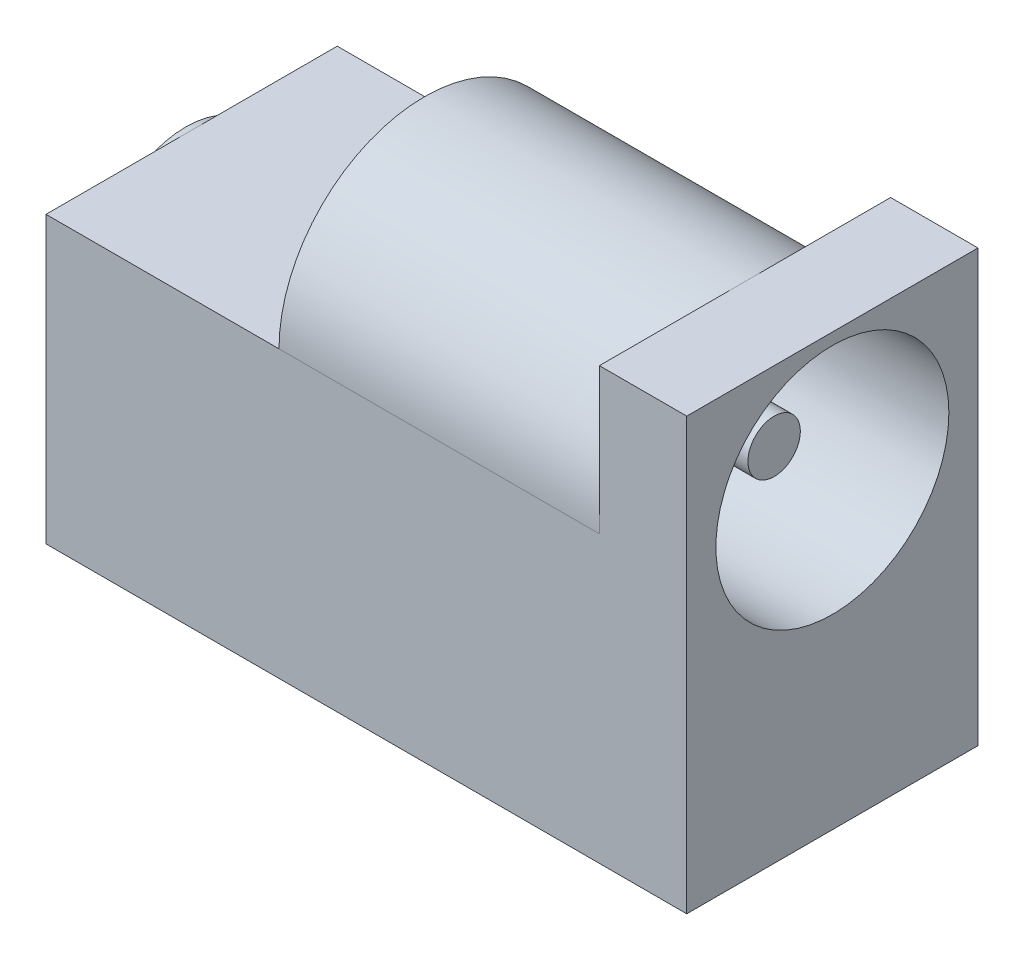
ISO-10303-21;
HEADER;
FILE_DESCRIPTION(('STEP AP214'),'2;1');
FILE_NAME('part.step','',(''),(''),'','','');
FILE_SCHEMA(('AUTOMOTIVE_DESIGN { 1 0 10303 214 1 1 1 1 }'));
ENDSEC;
DATA;
#1=APPLICATION_CONTEXT('core data for automotive mechanical design processes');
#2=APPLICATION_PROTOCOL_DEFINITION('international standard','automotive_design',2000,#1);
#3=PRODUCT_CONTEXT('',#1,'mechanical');
#4=PRODUCT('Part','Part','',(#3));
#5=PRODUCT_RELATED_PRODUCT_CATEGORY('part','',(#4));
#6=PRODUCT_DEFINITION_FORMATION('','',#4);
#7=PRODUCT_DEFINITION_CONTEXT('part definition',#1,'design');
#8=PRODUCT_DEFINITION('design','',#6,#7);
#9=PRODUCT_DEFINITION_SHAPE('','',#8);
#10=(LENGTH_UNIT() NAMED_UNIT(*) SI_UNIT(.MILLI.,.METRE.));
#11=(NAMED_UNIT(*) PLANE_ANGLE_UNIT() SI_UNIT($,.RADIAN.));
#12=(NAMED_UNIT(*) SI_UNIT($,.STERADIAN.) SOLID_ANGLE_UNIT());
#13=UNCERTAINTY_MEASURE_WITH_UNIT(LENGTH_MEASURE(1.E-05),#10,'distance_accuracy_value','');
#14=(GEOMETRIC_REPRESENTATION_CONTEXT(3) GLOBAL_UNCERTAINTY_ASSIGNED_CONTEXT((#13)) GLOBAL_UNIT_ASSIGNED_CONTEXT((#10,
#11,#12)) REPRESENTATION_CONTEXT('',''));
#15=CARTESIAN_POINT('',(0.,0.,0.));
#16=DIRECTION('',(0.,0.,1.));
#17=DIRECTION('',(1.,0.,0.));
#18=AXIS2_PLACEMENT_3D('',#15,#16,#17);
#19=CARTESIAN_POINT('',(0.75,3.69999999999999,-2.5));
#20=DIRECTION('',(0.,0.,1.));
#21=DIRECTION('',(0.,-1.,0.));
#22=AXIS2_PLACEMENT_3D('',#19,#20,#21);
#23=PLANE('',#22);
#24=DIRECTION('',(0.,-1.,0.));
#25=VECTOR('',#24,1.);
#26=CARTESIAN_POINT('',(-7.84999999999999,-3.70000000000001,-2.5));
#27=LINE('',#26,#25);
#28=CARTESIAN_POINT('',(-7.84999999999999,-1.3,-2.5));
#29=VERTEX_POINT('',#28);
#30=CARTESIAN_POINT('',(-7.84999999999999,-3.70000000000001,-2.5));
#31=VERTEX_POINT('',#30);
#32=EDGE_CURVE('E49',#29,#31,#27,.T.);
#33=ORIENTED_EDGE('',*,*,#32,.F.);
#34=DIRECTION('',(1.,0.,0.));
#35=VECTOR('',#34,1.);
#36=CARTESIAN_POINT('',(-7.84999999999999,-1.30000000000001,-2.5));
#37=LINE('',#36,#35);
#38=CARTESIAN_POINT('',(-9.35,-1.3,-2.5));
#39=VERTEX_POINT('',#38);
#40=EDGE_CURVE('E53',#39,#29,#37,.T.);
#41=ORIENTED_EDGE('',*,*,#40,.F.);
#42=DIRECTION('',(0.,1.,0.));
#43=VECTOR('',#42,1.);
#44=CARTESIAN_POINT('',(-9.35,-3.70000000000005,-2.5));
#45=LINE('',#44,#43);
#46=CARTESIAN_POINT('',(-9.35,-3.70000000000005,-2.5));
#47=VERTEX_POINT('',#46);
#48=EDGE_CURVE('E846',#47,#39,#45,.T.);
#49=ORIENTED_EDGE('',*,*,#48,.F.);
#50=DIRECTION('',(-1.,0.,0.));
#51=VECTOR('',#50,1.);
#52=CARTESIAN_POINT('',(0.75,-3.70000000000001,-2.5));
#53=LINE('',#52,#51);
#54=CARTESIAN_POINT('',(-10.25,-3.70000000000001,-2.5));
#55=VERTEX_POINT('',#54);
#56=EDGE_CURVE('E834',#47,#55,#53,.T.);
#57=ORIENTED_EDGE('',*,*,#56,.T.);
#58=DIRECTION('',(0.,-1.,0.));
#59=VECTOR('',#58,1.);
#60=CARTESIAN_POINT('',(-10.25,-3.70000000000001,-2.5));
#61=LINE('',#60,#59);
#62=CARTESIAN_POINT('',(-10.25,1.19999999999999,-2.5));
#63=VERTEX_POINT('',#62);
#64=EDGE_CURVE('E312',#63,#55,#61,.T.);
#65=ORIENTED_EDGE('',*,*,#64,.F.);
#66=DIRECTION('',(1.,0.,0.));
#67=VECTOR('',#66,1.);
#68=CARTESIAN_POINT('',(-10.25,1.19999999999999,-2.5));
#69=LINE('',#68,#67);
#70=CARTESIAN_POINT('',(-6.25,1.19999999999999,-2.5));
#71=VERTEX_POINT('',#70);
#72=EDGE_CURVE('E366',#63,#71,#69,.T.);
#73=ORIENTED_EDGE('',*,*,#72,.T.);
#74=DIRECTION('',(1.,0.,0.));
#75=VECTOR('',#74,1.);
#76=CARTESIAN_POINT('',(-6.25,1.19999999999999,-2.5));
#77=LINE('',#76,#75);
#78=CARTESIAN_POINT('',(-0.75,1.19999999999999,-2.5));
#79=VERTEX_POINT('',#78);
#80=EDGE_CURVE('E377',#71,#79,#77,.T.);
#81=ORIENTED_EDGE('',*,*,#80,.T.);
#82=DIRECTION('',(0.,1.,0.));
#83=VECTOR('',#82,1.);
#84=CARTESIAN_POINT('',(-0.75,3.69999999999999,-2.5));
#85=LINE('',#84,#83);
#86=CARTESIAN_POINT('',(-0.75,3.69999999999999,-2.5));
#87=VERTEX_POINT('',#86);
#88=EDGE_CURVE('E392',#79,#87,#85,.T.);
#89=ORIENTED_EDGE('',*,*,#88,.T.);
#90=DIRECTION('',(-1.,0.,0.));
#91=VECTOR('',#90,1.);
#92=CARTESIAN_POINT('',(0.75,3.69999999999999,-2.5));
#93=LINE('',#92,#91);
#94=CARTESIAN_POINT('',(0.75,3.69999999999999,-2.5));
#95=VERTEX_POINT('',#94);
#96=EDGE_CURVE('E836',#95,#87,#93,.T.);
#97=ORIENTED_EDGE('',*,*,#96,.F.);
#98=DIRECTION('',(0.,1.,0.));
#99=VECTOR('',#98,1.);
#100=CARTESIAN_POINT('',(0.75,3.69999999999999,-2.5));
#101=LINE('',#100,#99);
#102=CARTESIAN_POINT('',(0.75,-3.70000000000001,-2.5));
#103=VERTEX_POINT('',#102);
#104=EDGE_CURVE('E380',#103,#95,#101,.T.);
#105=ORIENTED_EDGE('',*,*,#104,.F.);
#106=EDGE_CURVE('E353',#103,#31,#53,.T.);
#107=ORIENTED_EDGE('',*,*,#106,.T.);
#108=EDGE_LOOP('',(#33,#41,#49,#57,#65,#73,#81,#89,#97,#105,#107));
#109=FACE_BOUND('',#108,.T.);
#110=ADVANCED_FACE('F32',(#109),#23,.F.);
#111=CARTESIAN_POINT('',(-10.35,-4.70000000000001,0.));
#112=DIRECTION('',(-1.,0.,0.));
#113=DIRECTION('',(0.,0.,1.));
#114=AXIS2_PLACEMENT_3D('',#111,#112,#113);
#115=PLANE('',#114);
#116=DIRECTION('',(0.,0.,1.));
#117=VECTOR('',#116,1.);
#118=CARTESIAN_POINT('',(-10.35,-3.70000000000001,-1.5));
#119=LINE('',#118,#117);
#120=CARTESIAN_POINT('',(-10.35,-3.70000000000001,-1.5));
#121=VERTEX_POINT('',#120);
#122=CARTESIAN_POINT('',(-10.35,-3.70000000000001,-0.5));
#123=VERTEX_POINT('',#122);
#124=EDGE_CURVE('E234',#121,#123,#119,.T.);
#125=ORIENTED_EDGE('',*,*,#124,.T.);
#126=DIRECTION('',(0.,-1.,0.));
#127=VECTOR('',#126,1.);
#128=CARTESIAN_POINT('',(-10.35,-3.70000000000001,-0.5));
#129=LINE('',#128,#127);
#130=CARTESIAN_POINT('',(-10.35,-4.70000000000001,-0.5));
#131=VERTEX_POINT('',#130);
#132=EDGE_CURVE('E237',#123,#131,#129,.T.);
#133=ORIENTED_EDGE('',*,*,#132,.T.);
#134=CARTESIAN_POINT('',(-10.35,-4.70000000000001,0.));
#135=DIRECTION('',(-1.,0.,0.));
#136=DIRECTION('',(0.,0.,1.));
#137=AXIS2_PLACEMENT_3D('',#134,#135,#136);
#138=CIRCLE('',#137,0.5);
#139=CARTESIAN_POINT('',(-10.35,-4.70000000000001,0.5));
#140=VERTEX_POINT('',#139);
#141=EDGE_CURVE('E240',#131,#140,#138,.T.);
#142=ORIENTED_EDGE('',*,*,#141,.T.);
#143=DIRECTION('',(0.,1.,0.));
#144=VECTOR('',#143,1.);
#145=CARTESIAN_POINT('',(-10.35,-3.70000000000001,0.5));
#146=LINE('',#145,#144);
#147=CARTESIAN_POINT('',(-10.35,-3.70000000000001,0.5));
#148=VERTEX_POINT('',#147);
#149=EDGE_CURVE('E242',#140,#148,#146,.T.);
#150=ORIENTED_EDGE('',*,*,#149,.T.);
#151=DIRECTION('',(0.,0.,1.));
#152=VECTOR('',#151,1.);
#153=CARTESIAN_POINT('',(-10.35,-3.70000000000001,1.5));
#154=LINE('',#153,#152);
#155=CARTESIAN_POINT('',(-10.35,-3.70000000000001,1.5));
#156=VERTEX_POINT('',#155);
#157=EDGE_CURVE('E244',#148,#156,#154,.T.);
#158=ORIENTED_EDGE('',*,*,#157,.T.);
#159=DIRECTION('',(0.,1.,0.));
#160=VECTOR('',#159,1.);
#161=CARTESIAN_POINT('',(-10.35,-3.70000000000001,1.5));
#162=LINE('',#161,#160);
#163=CARTESIAN_POINT('',(-10.35,-0.300000000000005,1.5));
#164=VERTEX_POINT('',#163);
#165=EDGE_CURVE('E246',#156,#164,#162,.T.);
#166=ORIENTED_EDGE('',*,*,#165,.T.);
#167=CARTESIAN_POINT('',(-10.35,-0.300000000000005,0.));
#168=DIRECTION('',(-1.,0.,0.));
#169=DIRECTION('',(0.,0.,-1.));
#170=AXIS2_PLACEMENT_3D('',#167,#168,#169);
#171=CIRCLE('',#170,1.5);
#172=CARTESIAN_POINT('',(-10.35,-0.300000000000005,-1.5));
#173=VERTEX_POINT('',#172);
#174=EDGE_CURVE('E248',#164,#173,#171,.T.);
#175=ORIENTED_EDGE('',*,*,#174,.T.);
#176=DIRECTION('',(0.,-1.,0.));
#177=VECTOR('',#176,1.);
#178=CARTESIAN_POINT('',(-10.35,-3.70000000000001,-1.5));
#179=LINE('',#178,#177);
#180=EDGE_CURVE('E250',#173,#121,#179,.T.);
#181=ORIENTED_EDGE('',*,*,#180,.T.);
#182=EDGE_LOOP('',(#125,#133,#142,#150,#158,#166,#175,#181));
#183=FACE_BOUND('',#182,.T.);
#184=CARTESIAN_POINT('',(-10.35,0.,0.));
#185=DIRECTION('',(-1.,0.,0.));
#186=DIRECTION('',(0.,0.,1.));
#187=AXIS2_PLACEMENT_3D('',#184,#185,#186);
#188=CIRCLE('',#187,0.385516529356866);
#189=CARTESIAN_POINT('',(-10.35,0.,0.385516529356866));
#190=VERTEX_POINT('',#189);
#191=EDGE_CURVE('E222',#190,#190,#188,.T.);
#192=ORIENTED_EDGE('',*,*,#191,.F.);
#193=EDGE_LOOP('',(#192));
#194=FACE_BOUND('',#193,.T.);
#195=ADVANCED_FACE('F413',(#183,#194),#115,.T.);
#196=CARTESIAN_POINT('',(-10.25,1.19999999999999,-2.5));
#197=DIRECTION('',(1.,0.,0.));
#198=DIRECTION('',(0.,0.,-1.));
#199=AXIS2_PLACEMENT_3D('',#196,#197,#198);
#200=PLANE('',#199);
#201=DIRECTION('',(0.,-1.,0.));
#202=VECTOR('',#201,1.);
#203=CARTESIAN_POINT('',(-10.25,-3.70000000000001,-1.5));
#204=LINE('',#203,#202);
#205=CARTESIAN_POINT('',(-10.25,-0.300000000000005,-1.5));
#206=VERTEX_POINT('',#205);
#207=CARTESIAN_POINT('',(-10.25,-3.70000000000001,-1.5));
#208=VERTEX_POINT('',#207);
#209=EDGE_CURVE('E238',#206,#208,#204,.T.);
#210=ORIENTED_EDGE('',*,*,#209,.F.);
#211=CARTESIAN_POINT('',(-10.25,-0.300000000000005,0.));
#212=DIRECTION('',(-1.,0.,0.));
#213=DIRECTION('',(0.,0.,-1.));
#214=AXIS2_PLACEMENT_3D('',#211,#212,#213);
#215=CIRCLE('',#214,1.5);
#216=CARTESIAN_POINT('',(-10.25,1.19999999999999,0.));
#217=VERTEX_POINT('',#216);
#218=EDGE_CURVE('E11',#217,#206,#215,.T.);
#219=ORIENTED_EDGE('',*,*,#218,.F.);
#220=DIRECTION('',(0.,0.,-1.));
#221=VECTOR('',#220,1.);
#222=CARTESIAN_POINT('',(-10.25,1.19999999999999,-2.5));
#223=LINE('',#222,#221);
#224=EDGE_CURVE('E361',#217,#63,#223,.T.);
#225=ORIENTED_EDGE('',*,*,#224,.T.);
#226=ORIENTED_EDGE('',*,*,#64,.T.);
#227=DIRECTION('',(0.,0.,1.));
#228=VECTOR('',#227,1.);
#229=CARTESIAN_POINT('',(-10.25,-3.70000000000001,-2.5));
#230=LINE('',#229,#228);
#231=EDGE_CURVE('E326',#55,#208,#230,.T.);
#232=ORIENTED_EDGE('',*,*,#231,.T.);
#233=EDGE_LOOP('',(#210,#219,#225,#226,#232));
#234=FACE_BOUND('',#233,.T.);
#235=ADVANCED_FACE('F408',(#234),#200,.F.);
#236=CARTESIAN_POINT('',(-10.25,-0.300000000000005,1.5));
#237=VERTEX_POINT('',#236);
#238=EDGE_CURVE('E42',#237,#217,#215,.T.);
#239=ORIENTED_EDGE('',*,*,#238,.F.);
#240=DIRECTION('',(0.,1.,0.));
#241=VECTOR('',#240,1.);
#242=CARTESIAN_POINT('',(-10.25,-3.70000000000001,1.5));
#243=LINE('',#242,#241);
#244=CARTESIAN_POINT('',(-10.25,-3.70000000000001,1.5));
#245=VERTEX_POINT('',#244);
#246=EDGE_CURVE('E257',#245,#237,#243,.T.);
#247=ORIENTED_EDGE('',*,*,#246,.F.);
#248=CARTESIAN_POINT('',(-10.25,-3.70000000000001,2.5));
#249=VERTEX_POINT('',#248);
#250=EDGE_CURVE('E315',#245,#249,#230,.T.);
#251=ORIENTED_EDGE('',*,*,#250,.T.);
#252=DIRECTION('',(0.,1.,0.));
#253=VECTOR('',#252,1.);
#254=CARTESIAN_POINT('',(-10.25,-3.70000000000001,2.5));
#255=LINE('',#254,#253);
#256=CARTESIAN_POINT('',(-10.25,1.19999999999999,2.5));
#257=VERTEX_POINT('',#256);
#258=EDGE_CURVE('E318',#249,#257,#255,.T.);
#259=ORIENTED_EDGE('',*,*,#258,.T.);
#260=EDGE_CURVE('E362',#257,#217,#223,.T.);
#261=ORIENTED_EDGE('',*,*,#260,.T.);
#262=EDGE_LOOP('',(#239,#247,#251,#259,#261));
#263=FACE_BOUND('',#262,.T.);
#264=ADVANCED_FACE('F338',(#263),#200,.F.);
#265=CARTESIAN_POINT('',(-3.25,1.49999999999999,0.));
#266=DIRECTION('',(1.,0.,0.));
#267=DIRECTION('',(0.,0.,-1.));
#268=AXIS2_PLACEMENT_3D('',#265,#266,#267);
#269=PLANE('',#268);
#270=CARTESIAN_POINT('',(-3.25,1.49999999999999,0.));
#271=DIRECTION('',(1.,0.,0.));
#272=DIRECTION('',(0.,0.,-1.));
#273=AXIS2_PLACEMENT_3D('',#270,#271,#272);
#274=CIRCLE('',#273,0.5);
#275=CARTESIAN_POINT('',(-3.25,1.49999999999999,-0.5));
#276=VERTEX_POINT('',#275);
#277=EDGE_CURVE('E300',#276,#276,#274,.T.);
#278=ORIENTED_EDGE('',*,*,#277,.T.);
#279=EDGE_LOOP('',(#278));
#280=FACE_BOUND('',#279,.T.);
#281=CARTESIAN_POINT('',(-3.25,1.49999999999999,0.));
#282=DIRECTION('',(1.,0.,0.));
#283=DIRECTION('',(0.,0.,-1.));
#284=AXIS2_PLACEMENT_3D('',#281,#282,#283);
#285=CIRCLE('',#284,0.45);
#286=CARTESIAN_POINT('',(-3.25,1.49999999999999,-0.45));
#287=VERTEX_POINT('',#286);
#288=EDGE_CURVE('E297',#287,#287,#285,.T.);
#289=ORIENTED_EDGE('',*,*,#288,.F.);
#290=EDGE_LOOP('',(#289));
#291=FACE_BOUND('',#290,.T.);
#292=ADVANCED_FACE('F624',(#280,#291),#269,.T.);
#293=CARTESIAN_POINT('',(-5.25,1.49999999999999,0.));
#294=DIRECTION('',(1.,0.,0.));
#295=DIRECTION('',(0.,0.,-1.));
#296=AXIS2_PLACEMENT_3D('',#293,#294,#295);
#297=PLANE('',#296);
#298=CARTESIAN_POINT('',(-5.25,1.49999999999999,0.));
#299=DIRECTION('',(1.,0.,0.));
#300=DIRECTION('',(0.,0.,-1.));
#301=AXIS2_PLACEMENT_3D('',#298,#299,#300);
#302=CIRCLE('',#301,2.);
#303=CARTESIAN_POINT('',(-5.25,1.49999999999999,-2.));
#304=VERTEX_POINT('',#303);
#305=EDGE_CURVE('E306',#304,#304,#302,.T.);
#306=ORIENTED_EDGE('',*,*,#305,.T.);
#307=EDGE_LOOP('',(#306));
#308=FACE_BOUND('',#307,.T.);
#309=CARTESIAN_POINT('',(-5.25,1.49999999999999,0.));
#310=DIRECTION('',(1.,0.,0.));
#311=DIRECTION('',(0.,0.,-1.));
#312=AXIS2_PLACEMENT_3D('',#309,#310,#311);
#313=CIRCLE('',#312,0.5);
#314=CARTESIAN_POINT('',(-5.25,1.49999999999999,-0.5));
#315=VERTEX_POINT('',#314);
#316=EDGE_CURVE('E296',#315,#315,#313,.T.);
#317=ORIENTED_EDGE('',*,*,#316,.F.);
#318=EDGE_LOOP('',(#317));
#319=FACE_BOUND('',#318,.T.);
#320=ADVANCED_FACE('F656',(#308,#319),#297,.T.);
#321=CARTESIAN_POINT('',(-6.25,1.19999999999999,0.));
#322=DIRECTION('',(1.,0.,0.));
#323=DIRECTION('',(0.,0.,-1.));
#324=AXIS2_PLACEMENT_3D('',#321,#322,#323);
#325=PLANE('',#324);
#326=DIRECTION('',(0.,0.,-1.));
#327=VECTOR('',#326,1.);
#328=CARTESIAN_POINT('',(-6.25,1.19999999999999,-2.5));
#329=LINE('',#328,#327);
#330=CARTESIAN_POINT('',(-6.25,1.19999999999999,2.5));
#331=VERTEX_POINT('',#330);
#332=EDGE_CURVE('E309',#331,#71,#329,.T.);
#333=ORIENTED_EDGE('',*,*,#332,.F.);
#334=CARTESIAN_POINT('',(-6.25,1.19999999999999,0.));
#335=DIRECTION('',(-1.,0.,0.));
#336=DIRECTION('',(0.,0.,-1.));
#337=AXIS2_PLACEMENT_3D('',#334,#335,#336);
#338=CIRCLE('',#337,2.5);
#339=EDGE_CURVE('E374',#331,#71,#338,.T.);
#340=ORIENTED_EDGE('',*,*,#339,.T.);
#341=EDGE_LOOP('',(#333,#340));
#342=FACE_BOUND('',#341,.T.);
#343=ADVANCED_FACE('F404',(#342),#325,.F.);
#344=CARTESIAN_POINT('',(-0.75,-3.70000000000001,-2.5));
#345=DIRECTION('',(1.,0.,0.));
#346=DIRECTION('',(0.,0.,-1.));
#347=AXIS2_PLACEMENT_3D('',#344,#345,#346);
#348=PLANE('',#347);
#349=CARTESIAN_POINT('',(-0.75,1.19999999999999,0.));
#350=DIRECTION('',(-1.,0.,0.));
#351=DIRECTION('',(0.,0.,-1.));
#352=AXIS2_PLACEMENT_3D('',#349,#350,#351);
#353=CIRCLE('',#352,2.5);
#354=CARTESIAN_POINT('',(-0.75,1.19999999999999,2.5));
#355=VERTEX_POINT('',#354);
#356=CARTESIAN_POINT('',(-0.75,3.69999999999999,0.));
#357=VERTEX_POINT('',#356);
#358=EDGE_CURVE('E373',#355,#357,#353,.T.);
#359=ORIENTED_EDGE('',*,*,#358,.F.);
#360=DIRECTION('',(0.,-1.,0.));
#361=VECTOR('',#360,1.);
#362=CARTESIAN_POINT('',(-0.75,3.69999999999999,2.5));
#363=LINE('',#362,#361);
#364=CARTESIAN_POINT('',(-0.75,3.69999999999999,2.5));
#365=VERTEX_POINT('',#364);
#366=EDGE_CURVE('E820',#365,#355,#363,.T.);
#367=ORIENTED_EDGE('',*,*,#366,.F.);
#368=DIRECTION('',(0.,0.,1.));
#369=VECTOR('',#368,1.);
#370=CARTESIAN_POINT('',(-0.75,3.69999999999999,2.5));
#371=LINE('',#370,#369);
#372=EDGE_CURVE('E395',#357,#365,#371,.T.);
#373=ORIENTED_EDGE('',*,*,#372,.F.);
#374=EDGE_LOOP('',(#359,#367,#373));
#375=FACE_BOUND('',#374,.T.);
#376=ADVANCED_FACE('F722',(#375),#348,.F.);
#377=EDGE_CURVE('E40',#357,#79,#353,.T.);
#378=ORIENTED_EDGE('',*,*,#377,.F.);
#379=EDGE_CURVE('E824',#87,#357,#371,.T.);
#380=ORIENTED_EDGE('',*,*,#379,.F.);
#381=ORIENTED_EDGE('',*,*,#88,.F.);
#382=EDGE_LOOP('',(#378,#380,#381));
#383=FACE_BOUND('',#382,.T.);
#384=ADVANCED_FACE('F731',(#383),#348,.F.);
#385=CARTESIAN_POINT('',(0.75,3.69999999999999,2.5));
#386=DIRECTION('',(0.,-1.,0.));
#387=DIRECTION('',(0.,0.,-1.));
#388=AXIS2_PLACEMENT_3D('',#385,#386,#387);
#389=PLANE('',#388);
#390=ORIENTED_EDGE('',*,*,#379,.T.);
#391=ORIENTED_EDGE('',*,*,#372,.T.);
#392=DIRECTION('',(-1.,0.,0.));
#393=VECTOR('',#392,1.);
#394=CARTESIAN_POINT('',(0.75,3.69999999999999,2.5));
#395=LINE('',#394,#393);
#396=CARTESIAN_POINT('',(0.75,3.69999999999999,2.5));
#397=VERTEX_POINT('',#396);
#398=EDGE_CURVE('E352',#397,#365,#395,.T.);
#399=ORIENTED_EDGE('',*,*,#398,.F.);
#400=DIRECTION('',(0.,0.,1.));
#401=VECTOR('',#400,1.);
#402=CARTESIAN_POINT('',(0.75,3.69999999999999,2.5));
#403=LINE('',#402,#401);
#404=EDGE_CURVE('E826',#95,#397,#403,.T.);
#405=ORIENTED_EDGE('',*,*,#404,.F.);
#406=ORIENTED_EDGE('',*,*,#96,.T.);
#407=EDGE_LOOP('',(#390,#391,#399,#405,#406));
#408=FACE_BOUND('',#407,.T.);
#409=ADVANCED_FACE('F713',(#408),#389,.F.);
#410=CARTESIAN_POINT('',(0.75,3.69999999999999,2.5));
#411=DIRECTION('',(0.,0.,-1.));
#412=DIRECTION('',(0.,1.,0.));
#413=AXIS2_PLACEMENT_3D('',#410,#411,#412);
#414=PLANE('',#413);
#415=ORIENTED_EDGE('',*,*,#366,.T.);
#416=DIRECTION('',(1.,0.,0.));
#417=VECTOR('',#416,1.);
#418=CARTESIAN_POINT('',(-6.25,1.19999999999999,2.5));
#419=LINE('',#418,#417);
#420=EDGE_CURVE('E390',#331,#355,#419,.T.);
#421=ORIENTED_EDGE('',*,*,#420,.F.);
#422=DIRECTION('',(1.,0.,0.));
#423=VECTOR('',#422,1.);
#424=CARTESIAN_POINT('',(-10.25,1.19999999999999,2.5));
#425=LINE('',#424,#423);
#426=EDGE_CURVE('E359',#257,#331,#425,.T.);
#427=ORIENTED_EDGE('',*,*,#426,.F.);
#428=ORIENTED_EDGE('',*,*,#258,.F.);
#429=DIRECTION('',(-1.,0.,0.));
#430=VECTOR('',#429,1.);
#431=CARTESIAN_POINT('',(0.75,-3.70000000000001,2.5));
#432=LINE('',#431,#430);
#433=CARTESIAN_POINT('',(0.75,-3.70000000000001,2.5));
#434=VERTEX_POINT('',#433);
#435=EDGE_CURVE('E346',#434,#249,#432,.T.);
#436=ORIENTED_EDGE('',*,*,#435,.F.);
#437=DIRECTION('',(0.,-1.,0.));
#438=VECTOR('',#437,1.);
#439=CARTESIAN_POINT('',(0.75,3.69999999999999,2.5));
#440=LINE('',#439,#438);
#441=EDGE_CURVE('E841',#397,#434,#440,.T.);
#442=ORIENTED_EDGE('',*,*,#441,.F.);
#443=ORIENTED_EDGE('',*,*,#398,.T.);
#444=EDGE_LOOP('',(#415,#421,#427,#428,#436,#442,#443));
#445=FACE_BOUND('',#444,.T.);
#446=ADVANCED_FACE('F356',(#445),#414,.F.);
#447=CARTESIAN_POINT('',(0.75,-3.70000000000001,2.5));
#448=DIRECTION('',(0.,1.,0.));
#449=DIRECTION('',(0.,0.,1.));
#450=AXIS2_PLACEMENT_3D('',#447,#448,#449);
#451=PLANE('',#450);
#452=ORIENTED_EDGE('',*,*,#435,.T.);
#453=ORIENTED_EDGE('',*,*,#250,.F.);
#454=DIRECTION('',(1.,0.,0.));
#455=VECTOR('',#454,1.);
#456=CARTESIAN_POINT('',(-10.35,-3.70000000000001,1.5));
#457=LINE('',#456,#455);
#458=EDGE_CURVE('E278',#156,#245,#457,.T.);
#459=ORIENTED_EDGE('',*,*,#458,.F.);
#460=ORIENTED_EDGE('',*,*,#157,.F.);
#461=DIRECTION('',(1.,0.,0.));
#462=VECTOR('',#461,1.);
#463=CARTESIAN_POINT('',(-10.35,-3.70000000000001,0.5));
#464=LINE('',#463,#462);
#465=CARTESIAN_POINT('',(-10.25,-3.70000000000001,0.5));
#466=VERTEX_POINT('',#465);
#467=EDGE_CURVE('E283',#148,#466,#464,.T.);
#468=ORIENTED_EDGE('',*,*,#467,.T.);
#469=CARTESIAN_POINT('',(-10.25,-3.70000000000001,-0.5));
#470=VERTEX_POINT('',#469);
#471=EDGE_CURVE('E328',#470,#466,#230,.T.);
#472=ORIENTED_EDGE('',*,*,#471,.F.);
#473=DIRECTION('',(1.,0.,0.));
#474=VECTOR('',#473,1.);
#475=CARTESIAN_POINT('',(-10.35,-3.70000000000001,-0.5));
#476=LINE('',#475,#474);
#477=EDGE_CURVE('E292',#123,#470,#476,.T.);
#478=ORIENTED_EDGE('',*,*,#477,.F.);
#479=ORIENTED_EDGE('',*,*,#124,.F.);
#480=DIRECTION('',(1.,0.,0.));
#481=VECTOR('',#480,1.);
#482=CARTESIAN_POINT('',(-10.35,-3.70000000000001,-1.5));
#483=LINE('',#482,#481);
#484=EDGE_CURVE('E252',#121,#208,#483,.T.);
#485=ORIENTED_EDGE('',*,*,#484,.T.);
#486=ORIENTED_EDGE('',*,*,#231,.F.);
#487=ORIENTED_EDGE('',*,*,#56,.F.);
#488=EDGE_CURVE('E833',#31,#47,#53,.T.);
#489=ORIENTED_EDGE('',*,*,#488,.F.);
#490=ORIENTED_EDGE('',*,*,#106,.F.);
#491=DIRECTION('',(0.,0.,-1.));
#492=VECTOR('',#491,1.);
#493=CARTESIAN_POINT('',(0.75,-3.70000000000001,2.5));
#494=LINE('',#493,#492);
#495=EDGE_CURVE('E349',#434,#103,#494,.T.);
#496=ORIENTED_EDGE('',*,*,#495,.F.);
#497=EDGE_LOOP('',(#452,#453,#459,#460,#468,#472,#478,#479,#485,#486,#487,#489,#490,#496));
#498=FACE_BOUND('',#497,.T.);
#499=ADVANCED_FACE('F347',(#498),#451,.F.);
#500=CARTESIAN_POINT('',(0.75,-3.70000000000001,-2.5));
#501=DIRECTION('',(1.,0.,0.));
#502=DIRECTION('',(0.,0.,-1.));
#503=AXIS2_PLACEMENT_3D('',#500,#501,#502);
#504=PLANE('',#503);
#505=CARTESIAN_POINT('',(0.75,1.49999999999999,0.));
#506=DIRECTION('',(1.,0.,0.));
#507=DIRECTION('',(0.,0.,-1.));
#508=AXIS2_PLACEMENT_3D('',#505,#506,#507);
#509=CIRCLE('',#508,2.);
#510=CARTESIAN_POINT('',(0.75,1.49999999999999,-2.));
#511=VERTEX_POINT('',#510);
#512=EDGE_CURVE('E303',#511,#511,#509,.T.);
#513=ORIENTED_EDGE('',*,*,#512,.F.);
#514=EDGE_LOOP('',(#513));
#515=FACE_BOUND('',#514,.T.);
#516=ORIENTED_EDGE('',*,*,#104,.T.);
#517=ORIENTED_EDGE('',*,*,#404,.T.);
#518=ORIENTED_EDGE('',*,*,#441,.T.);
#519=ORIENTED_EDGE('',*,*,#495,.T.);
#520=EDGE_LOOP('',(#516,#517,#518,#519));
#521=FACE_BOUND('',#520,.T.);
#522=ADVANCED_FACE('F687',(#515,#521),#504,.T.);
#523=CARTESIAN_POINT('',(-6.25,1.19999999999999,0.));
#524=DIRECTION('',(1.,0.,0.));
#525=DIRECTION('',(0.,0.,-1.));
#526=AXIS2_PLACEMENT_3D('',#523,#524,#525);
#527=CYLINDRICAL_SURFACE('',#526,2.5);
#528=ORIENTED_EDGE('',*,*,#358,.T.);
#529=ORIENTED_EDGE('',*,*,#377,.T.);
#530=ORIENTED_EDGE('',*,*,#80,.F.);
#531=ORIENTED_EDGE('',*,*,#339,.F.);
#532=ORIENTED_EDGE('',*,*,#420,.T.);
#533=EDGE_LOOP('',(#528,#529,#530,#531,#532));
#534=FACE_BOUND('',#533,.T.);
#535=ADVANCED_FACE('F402',(#534),#527,.T.);
#536=CARTESIAN_POINT('',(-10.25,1.19999999999999,-2.5));
#537=DIRECTION('',(0.,-1.,0.));
#538=DIRECTION('',(0.,0.,-1.));
#539=AXIS2_PLACEMENT_3D('',#536,#537,#538);
#540=PLANE('',#539);
#541=ORIENTED_EDGE('',*,*,#332,.T.);
#542=ORIENTED_EDGE('',*,*,#72,.F.);
#543=ORIENTED_EDGE('',*,*,#224,.F.);
#544=ORIENTED_EDGE('',*,*,#260,.F.);
#545=ORIENTED_EDGE('',*,*,#426,.T.);
#546=EDGE_LOOP('',(#541,#542,#543,#544,#545));
#547=FACE_BOUND('',#546,.T.);
#548=ADVANCED_FACE('F406',(#547),#540,.F.);
#549=CARTESIAN_POINT('',(-5.25,1.49999999999999,0.));
#550=DIRECTION('',(1.,0.,0.));
#551=DIRECTION('',(0.,0.,-1.));
#552=AXIS2_PLACEMENT_3D('',#549,#550,#551);
#553=CYLINDRICAL_SURFACE('',#552,2.);
#554=ORIENTED_EDGE('',*,*,#305,.F.);
#555=EDGE_LOOP('',(#554));
#556=FACE_BOUND('',#555,.T.);
#557=ORIENTED_EDGE('',*,*,#512,.T.);
#558=EDGE_LOOP('',(#557));
#559=FACE_BOUND('',#558,.T.);
#560=ADVANCED_FACE('F611',(#556,#559),#553,.F.);
#561=CARTESIAN_POINT('',(-3.25,1.49999999999999,0.));
#562=DIRECTION('',(-1.,0.,0.));
#563=DIRECTION('',(0.,0.,1.));
#564=AXIS2_PLACEMENT_3D('',#561,#562,#563);
#565=CYLINDRICAL_SURFACE('',#564,0.5);
#566=ORIENTED_EDGE('',*,*,#277,.F.);
#567=EDGE_LOOP('',(#566));
#568=FACE_BOUND('',#567,.T.);
#569=ORIENTED_EDGE('',*,*,#316,.T.);
#570=EDGE_LOOP('',(#569));
#571=FACE_BOUND('',#570,.T.);
#572=ADVANCED_FACE('F646',(#568,#571),#565,.T.);
#573=CARTESIAN_POINT('',(-0.25,1.49999999999999,0.));
#574=DIRECTION('',(-1.,0.,0.));
#575=DIRECTION('',(0.,0.,1.));
#576=AXIS2_PLACEMENT_3D('',#573,#574,#575);
#577=CYLINDRICAL_SURFACE('',#576,0.45);
#578=CARTESIAN_POINT('',(-0.25,1.49999999999999,0.));
#579=DIRECTION('',(1.,0.,0.));
#580=DIRECTION('',(0.,0.,-1.));
#581=AXIS2_PLACEMENT_3D('',#578,#579,#580);
#582=CIRCLE('',#581,0.45);
#583=CARTESIAN_POINT('',(-0.25,1.49999999999999,-0.45));
#584=VERTEX_POINT('',#583);
#585=EDGE_CURVE('E293',#584,#584,#582,.T.);
#586=ORIENTED_EDGE('',*,*,#585,.F.);
#587=EDGE_LOOP('',(#586));
#588=FACE_BOUND('',#587,.T.);
#589=ORIENTED_EDGE('',*,*,#288,.T.);
#590=EDGE_LOOP('',(#589));
#591=FACE_BOUND('',#590,.T.);
#592=ADVANCED_FACE('F454',(#588,#591),#577,.T.);
#593=CARTESIAN_POINT('',(-0.25,1.49999999999999,0.));
#594=DIRECTION('',(1.,0.,0.));
#595=DIRECTION('',(0.,0.,-1.));
#596=AXIS2_PLACEMENT_3D('',#593,#594,#595);
#597=PLANE('',#596);
#598=ORIENTED_EDGE('',*,*,#585,.T.);
#599=EDGE_LOOP('',(#598));
#600=FACE_BOUND('',#599,.T.);
#601=ADVANCED_FACE('F447',(#600),#597,.T.);
#602=CARTESIAN_POINT('',(-10.25,-4.70000000000001,0.));
#603=DIRECTION('',(-1.,0.,0.));
#604=DIRECTION('',(0.,0.,1.));
#605=AXIS2_PLACEMENT_3D('',#602,#603,#604);
#606=PLANE('',#605);
#607=DIRECTION('',(0.,-1.,0.));
#608=VECTOR('',#607,1.);
#609=CARTESIAN_POINT('',(-10.25,-3.70000000000001,-0.5));
#610=LINE('',#609,#608);
#611=CARTESIAN_POINT('',(-10.25,-4.70000000000001,-0.5));
#612=VERTEX_POINT('',#611);
#613=EDGE_CURVE('E232',#470,#612,#610,.T.);
#614=ORIENTED_EDGE('',*,*,#613,.F.);
#615=ORIENTED_EDGE('',*,*,#471,.T.);
#616=DIRECTION('',(0.,1.,0.));
#617=VECTOR('',#616,1.);
#618=CARTESIAN_POINT('',(-10.25,-3.70000000000001,0.5));
#619=LINE('',#618,#617);
#620=CARTESIAN_POINT('',(-10.25,-4.70000000000001,0.5));
#621=VERTEX_POINT('',#620);
#622=EDGE_CURVE('E254',#621,#466,#619,.T.);
#623=ORIENTED_EDGE('',*,*,#622,.F.);
#624=CARTESIAN_POINT('',(-10.25,-4.70000000000001,0.));
#625=DIRECTION('',(-1.,0.,0.));
#626=DIRECTION('',(0.,0.,1.));
#627=AXIS2_PLACEMENT_3D('',#624,#625,#626);
#628=CIRCLE('',#627,0.5);
#629=EDGE_CURVE('E253',#612,#621,#628,.T.);
#630=ORIENTED_EDGE('',*,*,#629,.F.);
#631=EDGE_LOOP('',(#614,#615,#623,#630));
#632=FACE_BOUND('',#631,.T.);
#633=ADVANCED_FACE('F445',(#632),#606,.F.);
#634=CARTESIAN_POINT('',(-10.35,-3.70000000000001,-0.5));
#635=DIRECTION('',(0.,0.,1.));
#636=DIRECTION('',(0.,-1.,0.));
#637=AXIS2_PLACEMENT_3D('',#634,#635,#636);
#638=PLANE('',#637);
#639=ORIENTED_EDGE('',*,*,#613,.T.);
#640=DIRECTION('',(1.,0.,0.));
#641=VECTOR('',#640,1.);
#642=CARTESIAN_POINT('',(-10.35,-4.70000000000001,-0.5));
#643=LINE('',#642,#641);
#644=EDGE_CURVE('E289',#131,#612,#643,.T.);
#645=ORIENTED_EDGE('',*,*,#644,.F.);
#646=ORIENTED_EDGE('',*,*,#132,.F.);
#647=ORIENTED_EDGE('',*,*,#477,.T.);
#648=EDGE_LOOP('',(#639,#645,#646,#647));
#649=FACE_BOUND('',#648,.T.);
#650=ADVANCED_FACE('F435',(#649),#638,.F.);
#651=CARTESIAN_POINT('',(-10.35,-4.70000000000001,0.));
#652=DIRECTION('',(1.,0.,0.));
#653=DIRECTION('',(0.,0.,-1.));
#654=AXIS2_PLACEMENT_3D('',#651,#652,#653);
#655=CYLINDRICAL_SURFACE('',#654,0.5);
#656=ORIENTED_EDGE('',*,*,#629,.T.);
#657=DIRECTION('',(1.,0.,0.));
#658=VECTOR('',#657,1.);
#659=CARTESIAN_POINT('',(-10.35,-4.70000000000001,0.5));
#660=LINE('',#659,#658);
#661=EDGE_CURVE('E286',#140,#621,#660,.T.);
#662=ORIENTED_EDGE('',*,*,#661,.F.);
#663=ORIENTED_EDGE('',*,*,#141,.F.);
#664=ORIENTED_EDGE('',*,*,#644,.T.);
#665=EDGE_LOOP('',(#656,#662,#663,#664));
#666=FACE_BOUND('',#665,.T.);
#667=ADVANCED_FACE('F440',(#666),#655,.T.);
#668=CARTESIAN_POINT('',(-10.35,-3.70000000000001,0.5));
#669=DIRECTION('',(0.,0.,-1.));
#670=DIRECTION('',(0.,1.,0.));
#671=AXIS2_PLACEMENT_3D('',#668,#669,#670);
#672=PLANE('',#671);
#673=ORIENTED_EDGE('',*,*,#622,.T.);
#674=ORIENTED_EDGE('',*,*,#467,.F.);
#675=ORIENTED_EDGE('',*,*,#149,.F.);
#676=ORIENTED_EDGE('',*,*,#661,.T.);
#677=EDGE_LOOP('',(#673,#674,#675,#676));
#678=FACE_BOUND('',#677,.T.);
#679=ADVANCED_FACE('F444',(#678),#672,.F.);
#680=CARTESIAN_POINT('',(-10.35,-3.70000000000001,1.5));
#681=DIRECTION('',(0.,0.,-1.));
#682=DIRECTION('',(0.,1.,0.));
#683=AXIS2_PLACEMENT_3D('',#680,#681,#682);
#684=PLANE('',#683);
#685=ORIENTED_EDGE('',*,*,#246,.T.);
#686=DIRECTION('',(1.,0.,0.));
#687=VECTOR('',#686,1.);
#688=CARTESIAN_POINT('',(-10.35,-0.300000000000005,1.5));
#689=LINE('',#688,#687);
#690=EDGE_CURVE('E273',#164,#237,#689,.T.);
#691=ORIENTED_EDGE('',*,*,#690,.F.);
#692=ORIENTED_EDGE('',*,*,#165,.F.);
#693=ORIENTED_EDGE('',*,*,#458,.T.);
#694=EDGE_LOOP('',(#685,#691,#692,#693));
#695=FACE_BOUND('',#694,.T.);
#696=ADVANCED_FACE('F419',(#695),#684,.F.);
#697=CARTESIAN_POINT('',(-10.35,-0.300000000000005,0.));
#698=DIRECTION('',(1.,0.,0.));
#699=DIRECTION('',(0.,0.,-1.));
#700=AXIS2_PLACEMENT_3D('',#697,#698,#699);
#701=CYLINDRICAL_SURFACE('',#700,1.5);
#702=ORIENTED_EDGE('',*,*,#238,.T.);
#703=ORIENTED_EDGE('',*,*,#218,.T.);
#704=DIRECTION('',(1.,0.,0.));
#705=VECTOR('',#704,1.);
#706=CARTESIAN_POINT('',(-10.35,-0.300000000000005,-1.5));
#707=LINE('',#706,#705);
#708=EDGE_CURVE('E260',#173,#206,#707,.T.);
#709=ORIENTED_EDGE('',*,*,#708,.F.);
#710=ORIENTED_EDGE('',*,*,#174,.F.);
#711=ORIENTED_EDGE('',*,*,#690,.T.);
#712=EDGE_LOOP('',(#702,#703,#709,#710,#711));
#713=FACE_BOUND('',#712,.T.);
#714=ADVANCED_FACE('F407',(#713),#701,.T.);
#715=CARTESIAN_POINT('',(-10.35,-3.70000000000001,-1.5));
#716=DIRECTION('',(0.,0.,1.));
#717=DIRECTION('',(1.,0.,0.));
#718=AXIS2_PLACEMENT_3D('',#715,#716,#717);
#719=PLANE('',#718);
#720=ORIENTED_EDGE('',*,*,#209,.T.);
#721=ORIENTED_EDGE('',*,*,#484,.F.);
#722=ORIENTED_EDGE('',*,*,#180,.F.);
#723=ORIENTED_EDGE('',*,*,#708,.T.);
#724=EDGE_LOOP('',(#720,#721,#722,#723));
#725=FACE_BOUND('',#724,.T.);
#726=ADVANCED_FACE('F409',(#725),#719,.F.);
#727=CARTESIAN_POINT('',(-10.45,0.,0.));
#728=DIRECTION('',(1.,0.,0.));
#729=DIRECTION('',(0.,0.,-1.));
#730=AXIS2_PLACEMENT_3D('',#727,#728,#729);
#731=CYLINDRICAL_SURFACE('',#730,0.385516529356866);
#732=CARTESIAN_POINT('',(-10.45,0.,0.));
#733=DIRECTION('',(-1.,0.,0.));
#734=DIRECTION('',(0.,0.,1.));
#735=AXIS2_PLACEMENT_3D('',#732,#733,#734);
#736=CIRCLE('',#735,0.385516529356866);
#737=CARTESIAN_POINT('',(-10.45,0.,0.385516529356866));
#738=VERTEX_POINT('',#737);
#739=EDGE_CURVE('E225',#738,#738,#736,.T.);
#740=ORIENTED_EDGE('',*,*,#739,.F.);
#741=EDGE_LOOP('',(#740));
#742=FACE_BOUND('',#741,.T.);
#743=ORIENTED_EDGE('',*,*,#191,.T.);
#744=EDGE_LOOP('',(#743));
#745=FACE_BOUND('',#744,.T.);
#746=ADVANCED_FACE('F468',(#742,#745),#731,.T.);
#747=CARTESIAN_POINT('',(-10.45,0.,0.));
#748=DIRECTION('',(-1.,0.,0.));
#749=DIRECTION('',(0.,0.,1.));
#750=AXIS2_PLACEMENT_3D('',#747,#748,#749);
#751=PLANE('',#750);
#752=ORIENTED_EDGE('',*,*,#739,.T.);
#753=EDGE_LOOP('',(#752));
#754=FACE_BOUND('',#753,.T.);
#755=ADVANCED_FACE('F471',(#754),#751,.T.);
#756=CARTESIAN_POINT('',(-7.84999999999999,-1.30000000000001,-2.5));
#757=DIRECTION('',(0.,0.,1.));
#758=DIRECTION('',(0.,-1.,0.));
#759=AXIS2_PLACEMENT_3D('',#756,#757,#758);
#760=PLANE('',#759);
#761=ORIENTED_EDGE('',*,*,#488,.T.);
#762=DIRECTION('',(-0.707106781186634,0.707106781186461,0.));
#763=VECTOR('',#762,1.);
#764=CARTESIAN_POINT('',(-8.93129023716343,-4.11870976283651,-2.5));
#765=LINE('',#764,#763);
#766=CARTESIAN_POINT('',(-8.93129023716343,-4.11870976283651,-2.5));
#767=VERTEX_POINT('',#766);
#768=EDGE_CURVE('E850',#767,#47,#765,.T.);
#769=ORIENTED_EDGE('',*,*,#768,.F.);
#770=DIRECTION('',(0.,1.,0.));
#771=VECTOR('',#770,1.);
#772=CARTESIAN_POINT('',(-8.93129023716343,-5.19742690011984,-2.5));
#773=LINE('',#772,#771);
#774=CARTESIAN_POINT('',(-8.93129023716343,-5.19742690011984,-2.5));
#775=VERTEX_POINT('',#774);
#776=EDGE_CURVE('E853',#775,#767,#773,.T.);
#777=ORIENTED_EDGE('',*,*,#776,.F.);
#778=DIRECTION('',(-0.707106781186604,0.707106781186491,0.));
#779=VECTOR('',#778,1.);
#780=CARTESIAN_POINT('',(-8.6,-5.52871713728322,-2.5));
#781=LINE('',#780,#779);
#782=CARTESIAN_POINT('',(-8.6,-5.52871713728322,-2.5));
#783=VERTEX_POINT('',#782);
#784=EDGE_CURVE('E882',#783,#775,#781,.T.);
#785=ORIENTED_EDGE('',*,*,#784,.F.);
#786=DIRECTION('',(-0.707106781186622,-0.707106781186473,0.));
#787=VECTOR('',#786,1.);
#788=CARTESIAN_POINT('',(-8.26870976283655,-5.19742690011984,-2.5));
#789=LINE('',#788,#787);
#790=CARTESIAN_POINT('',(-8.26870976283655,-5.19742690011984,-2.5));
#791=VERTEX_POINT('',#790);
#792=EDGE_CURVE('E876',#791,#783,#789,.T.);
#793=ORIENTED_EDGE('',*,*,#792,.F.);
#794=DIRECTION('',(0.,-1.,0.));
#795=VECTOR('',#794,1.);
#796=CARTESIAN_POINT('',(-8.26870976283661,-4.11870976283651,-2.5));
#797=LINE('',#796,#795);
#798=CARTESIAN_POINT('',(-8.26870976283661,-4.11870976283651,-2.5));
#799=VERTEX_POINT('',#798);
#800=EDGE_CURVE('E880',#799,#791,#797,.T.);
#801=ORIENTED_EDGE('',*,*,#800,.F.);
#802=DIRECTION('',(-0.707106781186646,-0.707106781186449,0.));
#803=VECTOR('',#802,1.);
#804=CARTESIAN_POINT('',(-7.84999999999999,-3.70000000000001,-2.5));
#805=LINE('',#804,#803);
#806=EDGE_CURVE('E885',#31,#799,#805,.T.);
#807=ORIENTED_EDGE('',*,*,#806,.F.);
#808=EDGE_LOOP('',(#761,#769,#777,#785,#793,#801,#807));
#809=FACE_BOUND('',#808,.T.);
#810=ADVANCED_FACE('F475',(#809),#760,.T.);
#811=CARTESIAN_POINT('',(-7.84999999999999,-3.70000000000001,-2.6));
#812=DIRECTION('',(-1.,0.,0.));
#813=DIRECTION('',(0.,0.,1.));
#814=AXIS2_PLACEMENT_3D('',#811,#812,#813);
#815=PLANE('',#814);
#816=ORIENTED_EDGE('',*,*,#32,.T.);
#817=DIRECTION('',(0.,0.,1.));
#818=VECTOR('',#817,1.);
#819=CARTESIAN_POINT('',(-7.84999999999999,-3.70000000000001,-2.6));
#820=LINE('',#819,#818);
#821=CARTESIAN_POINT('',(-7.84999999999999,-3.70000000000001,-2.6));
#822=VERTEX_POINT('',#821);
#823=EDGE_CURVE('E205',#822,#31,#820,.T.);
#824=ORIENTED_EDGE('',*,*,#823,.F.);
#825=DIRECTION('',(0.,-1.,0.));
#826=VECTOR('',#825,1.);
#827=CARTESIAN_POINT('',(-7.84999999999999,-3.70000000000001,-2.6));
#828=LINE('',#827,#826);
#829=CARTESIAN_POINT('',(-7.84999999999999,-1.30000000000001,-2.6));
#830=VERTEX_POINT('',#829);
#831=EDGE_CURVE('E211',#830,#822,#828,.T.);
#832=ORIENTED_EDGE('',*,*,#831,.F.);
#833=DIRECTION('',(0.,0.,1.));
#834=VECTOR('',#833,1.);
#835=CARTESIAN_POINT('',(-7.84999999999999,-1.30000000000001,-2.6));
#836=LINE('',#835,#834);
#837=EDGE_CURVE('E857',#830,#29,#836,.T.);
#838=ORIENTED_EDGE('',*,*,#837,.T.);
#839=EDGE_LOOP('',(#816,#824,#832,#838));
#840=FACE_BOUND('',#839,.T.);
#841=ADVANCED_FACE('F221',(#840),#815,.F.);
#842=CARTESIAN_POINT('',(-7.84999999999999,-3.70000000000001,-2.6));
#843=DIRECTION('',(-0.707106781186449,0.707106781186646,0.));
#844=DIRECTION('',(-0.707106781186646,-0.707106781186449,0.));
#845=AXIS2_PLACEMENT_3D('',#842,#843,#844);
#846=PLANE('',#845);
#847=ORIENTED_EDGE('',*,*,#806,.T.);
#848=DIRECTION('',(0.,0.,1.));
#849=VECTOR('',#848,1.);
#850=CARTESIAN_POINT('',(-8.26870976283661,-4.11870976283651,-2.6));
#851=LINE('',#850,#849);
#852=CARTESIAN_POINT('',(-8.26870976283661,-4.11870976283651,-2.6));
#853=VERTEX_POINT('',#852);
#854=EDGE_CURVE('E207',#853,#799,#851,.T.);
#855=ORIENTED_EDGE('',*,*,#854,.F.);
#856=DIRECTION('',(-0.707106781186646,-0.707106781186449,0.));
#857=VECTOR('',#856,1.);
#858=CARTESIAN_POINT('',(-7.84999999999999,-3.70000000000001,-2.6));
#859=LINE('',#858,#857);
#860=EDGE_CURVE('E201',#822,#853,#859,.T.);
#861=ORIENTED_EDGE('',*,*,#860,.F.);
#862=ORIENTED_EDGE('',*,*,#823,.T.);
#863=EDGE_LOOP('',(#847,#855,#861,#862));
#864=FACE_BOUND('',#863,.T.);
#865=ADVANCED_FACE('F203',(#864),#846,.F.);
#866=CARTESIAN_POINT('',(-8.26870976283661,-4.11870976283651,-2.6));
#867=DIRECTION('',(-1.,0.,0.));
#868=DIRECTION('',(0.,-1.,0.));
#869=AXIS2_PLACEMENT_3D('',#866,#867,#868);
#870=PLANE('',#869);
#871=ORIENTED_EDGE('',*,*,#800,.T.);
#872=DIRECTION('',(0.,0.,1.));
#873=VECTOR('',#872,1.);
#874=CARTESIAN_POINT('',(-8.26870976283655,-5.19742690011984,-2.6));
#875=LINE('',#874,#873);
#876=CARTESIAN_POINT('',(-8.26870976283655,-5.19742690011984,-2.6));
#877=VERTEX_POINT('',#876);
#878=EDGE_CURVE('E227',#877,#791,#875,.T.);
#879=ORIENTED_EDGE('',*,*,#878,.F.);
#880=DIRECTION('',(0.,-1.,0.));
#881=VECTOR('',#880,1.);
#882=CARTESIAN_POINT('',(-8.26870976283661,-4.11870976283651,-2.6));
#883=LINE('',#882,#881);
#884=EDGE_CURVE('E210',#853,#877,#883,.T.);
#885=ORIENTED_EDGE('',*,*,#884,.F.);
#886=ORIENTED_EDGE('',*,*,#854,.T.);
#887=EDGE_LOOP('',(#871,#879,#885,#886));
#888=FACE_BOUND('',#887,.T.);
#889=ADVANCED_FACE('F481',(#888),#870,.F.);
#890=CARTESIAN_POINT('',(-8.26870976283655,-5.19742690011984,-2.6));
#891=DIRECTION('',(-0.707106781186473,0.707106781186623,0.));
#892=DIRECTION('',(-0.707106781186623,-0.707106781186473,0.));
#893=AXIS2_PLACEMENT_3D('',#890,#891,#892);
#894=PLANE('',#893);
#895=ORIENTED_EDGE('',*,*,#792,.T.);
#896=DIRECTION('',(0.,0.,1.));
#897=VECTOR('',#896,1.);
#898=CARTESIAN_POINT('',(-8.6,-5.52871713728322,-2.6));
#899=LINE('',#898,#897);
#900=CARTESIAN_POINT('',(-8.6,-5.52871713728322,-2.6));
#901=VERTEX_POINT('',#900);
#902=EDGE_CURVE('E869',#901,#783,#899,.T.);
#903=ORIENTED_EDGE('',*,*,#902,.F.);
#904=DIRECTION('',(-0.707106781186622,-0.707106781186473,0.));
#905=VECTOR('',#904,1.);
#906=CARTESIAN_POINT('',(-8.26870976283655,-5.19742690011984,-2.6));
#907=LINE('',#906,#905);
#908=EDGE_CURVE('E877',#877,#901,#907,.T.);
#909=ORIENTED_EDGE('',*,*,#908,.F.);
#910=ORIENTED_EDGE('',*,*,#878,.T.);
#911=EDGE_LOOP('',(#895,#903,#909,#910));
#912=FACE_BOUND('',#911,.T.);
#913=ADVANCED_FACE('F484',(#912),#894,.F.);
#914=CARTESIAN_POINT('',(-8.6,-5.52871713728322,-2.6));
#915=DIRECTION('',(0.707106781186491,0.707106781186604,0.));
#916=DIRECTION('',(-0.707106781186604,0.707106781186491,0.));
#917=AXIS2_PLACEMENT_3D('',#914,#915,#916);
#918=PLANE('',#917);
#919=ORIENTED_EDGE('',*,*,#784,.T.);
#920=DIRECTION('',(0.,0.,1.));
#921=VECTOR('',#920,1.);
#922=CARTESIAN_POINT('',(-8.93129023716343,-5.19742690011984,-2.6));
#923=LINE('',#922,#921);
#924=CARTESIAN_POINT('',(-8.93129023716343,-5.19742690011984,-2.6));
#925=VERTEX_POINT('',#924);
#926=EDGE_CURVE('E866',#925,#775,#923,.T.);
#927=ORIENTED_EDGE('',*,*,#926,.F.);
#928=DIRECTION('',(-0.707106781186604,0.707106781186491,0.));
#929=VECTOR('',#928,1.);
#930=CARTESIAN_POINT('',(-8.6,-5.52871713728322,-2.6));
#931=LINE('',#930,#929);
#932=EDGE_CURVE('E899',#901,#925,#931,.T.);
#933=ORIENTED_EDGE('',*,*,#932,.F.);
#934=ORIENTED_EDGE('',*,*,#902,.T.);
#935=EDGE_LOOP('',(#919,#927,#933,#934));
#936=FACE_BOUND('',#935,.T.);
#937=ADVANCED_FACE('F488',(#936),#918,.F.);
#938=CARTESIAN_POINT('',(-8.93129023716343,-5.19742690011984,-2.6));
#939=DIRECTION('',(1.,0.,0.));
#940=DIRECTION('',(0.,0.,-1.));
#941=AXIS2_PLACEMENT_3D('',#938,#939,#940);
#942=PLANE('',#941);
#943=ORIENTED_EDGE('',*,*,#776,.T.);
#944=DIRECTION('',(0.,0.,1.));
#945=VECTOR('',#944,1.);
#946=CARTESIAN_POINT('',(-8.93129023716343,-4.11870976283651,-2.6));
#947=LINE('',#946,#945);
#948=CARTESIAN_POINT('',(-8.93129023716343,-4.11870976283651,-2.6));
#949=VERTEX_POINT('',#948);
#950=EDGE_CURVE('E863',#949,#767,#947,.T.);
#951=ORIENTED_EDGE('',*,*,#950,.F.);
#952=DIRECTION('',(0.,1.,0.));
#953=VECTOR('',#952,1.);
#954=CARTESIAN_POINT('',(-8.93129023716343,-5.19742690011984,-2.6));
#955=LINE('',#954,#953);
#956=EDGE_CURVE('E896',#925,#949,#955,.T.);
#957=ORIENTED_EDGE('',*,*,#956,.F.);
#958=ORIENTED_EDGE('',*,*,#926,.T.);
#959=EDGE_LOOP('',(#943,#951,#957,#958));
#960=FACE_BOUND('',#959,.T.);
#961=ADVANCED_FACE('F492',(#960),#942,.F.);
#962=CARTESIAN_POINT('',(-8.93129023716343,-4.11870976283651,-2.6));
#963=DIRECTION('',(0.707106781186462,0.707106781186634,0.));
#964=DIRECTION('',(-0.707106781186634,0.707106781186462,0.));
#965=AXIS2_PLACEMENT_3D('',#962,#963,#964);
#966=PLANE('',#965);
#967=ORIENTED_EDGE('',*,*,#768,.T.);
#968=DIRECTION('',(0.,0.,1.));
#969=VECTOR('',#968,1.);
#970=CARTESIAN_POINT('',(-9.35,-3.70000000000005,-2.6));
#971=LINE('',#970,#969);
#972=CARTESIAN_POINT('',(-9.35,-3.70000000000005,-2.6));
#973=VERTEX_POINT('',#972);
#974=EDGE_CURVE('E861',#973,#47,#971,.T.);
#975=ORIENTED_EDGE('',*,*,#974,.F.);
#976=DIRECTION('',(-0.707106781186634,0.707106781186461,0.));
#977=VECTOR('',#976,1.);
#978=CARTESIAN_POINT('',(-8.93129023716343,-4.11870976283651,-2.6));
#979=LINE('',#978,#977);
#980=EDGE_CURVE('E893',#949,#973,#979,.T.);
#981=ORIENTED_EDGE('',*,*,#980,.F.);
#982=ORIENTED_EDGE('',*,*,#950,.T.);
#983=EDGE_LOOP('',(#967,#975,#981,#982));
#984=FACE_BOUND('',#983,.T.);
#985=ADVANCED_FACE('F496',(#984),#966,.F.);
#986=CARTESIAN_POINT('',(-9.35,-3.70000000000005,-2.6));
#987=DIRECTION('',(1.,0.,0.));
#988=DIRECTION('',(0.,0.,-1.));
#989=AXIS2_PLACEMENT_3D('',#986,#987,#988);
#990=PLANE('',#989);
#991=ORIENTED_EDGE('',*,*,#48,.T.);
#992=DIRECTION('',(0.,0.,1.));
#993=VECTOR('',#992,1.);
#994=CARTESIAN_POINT('',(-9.35,-1.30000000000001,-2.6));
#995=LINE('',#994,#993);
#996=CARTESIAN_POINT('',(-9.35,-1.30000000000001,-2.6));
#997=VERTEX_POINT('',#996);
#998=EDGE_CURVE('E859',#997,#39,#995,.T.);
#999=ORIENTED_EDGE('',*,*,#998,.F.);
#1000=DIRECTION('',(0.,1.,0.));
#1001=VECTOR('',#1000,1.);
#1002=CARTESIAN_POINT('',(-9.35,-3.70000000000005,-2.6));
#1003=LINE('',#1002,#1001);
#1004=EDGE_CURVE('E895',#973,#997,#1003,.T.);
#1005=ORIENTED_EDGE('',*,*,#1004,.F.);
#1006=ORIENTED_EDGE('',*,*,#974,.T.);
#1007=EDGE_LOOP('',(#991,#999,#1005,#1006));
#1008=FACE_BOUND('',#1007,.T.);
#1009=ADVANCED_FACE('F500',(#1008),#990,.F.);
#1010=CARTESIAN_POINT('',(-7.84999999999999,-1.30000000000001,-2.6));
#1011=DIRECTION('',(0.,-1.,0.));
#1012=DIRECTION('',(1.,0.,0.));
#1013=AXIS2_PLACEMENT_3D('',#1010,#1011,#1012);
#1014=PLANE('',#1013);
#1015=ORIENTED_EDGE('',*,*,#40,.T.);
#1016=ORIENTED_EDGE('',*,*,#837,.F.);
#1017=DIRECTION('',(1.,0.,0.));
#1018=VECTOR('',#1017,1.);
#1019=CARTESIAN_POINT('',(-7.84999999999999,-1.30000000000001,-2.6));
#1020=LINE('',#1019,#1018);
#1021=EDGE_CURVE('E216',#997,#830,#1020,.T.);
#1022=ORIENTED_EDGE('',*,*,#1021,.F.);
#1023=ORIENTED_EDGE('',*,*,#998,.T.);
#1024=EDGE_LOOP('',(#1015,#1016,#1022,#1023));
#1025=FACE_BOUND('',#1024,.T.);
#1026=ADVANCED_FACE('F504',(#1025),#1014,.F.);
#1027=CARTESIAN_POINT('',(-7.84999999999999,-1.30000000000001,-2.6));
#1028=DIRECTION('',(0.,0.,1.));
#1029=DIRECTION('',(0.,-1.,0.));
#1030=AXIS2_PLACEMENT_3D('',#1027,#1028,#1029);
#1031=PLANE('',#1030);
#1032=ORIENTED_EDGE('',*,*,#831,.T.);
#1033=ORIENTED_EDGE('',*,*,#860,.T.);
#1034=ORIENTED_EDGE('',*,*,#884,.T.);
#1035=ORIENTED_EDGE('',*,*,#908,.T.);
#1036=ORIENTED_EDGE('',*,*,#932,.T.);
#1037=ORIENTED_EDGE('',*,*,#956,.T.);
#1038=ORIENTED_EDGE('',*,*,#980,.T.);
#1039=ORIENTED_EDGE('',*,*,#1004,.T.);
#1040=ORIENTED_EDGE('',*,*,#1021,.T.);
#1041=EDGE_LOOP('',(#1032,#1033,#1034,#1035,#1036,#1037,#1038,#1039,#1040));
#1042=FACE_BOUND('',#1041,.T.);
#1043=ADVANCED_FACE('F214',(#1042),#1031,.F.);
#1044=CLOSED_SHELL('',(#110,#195,#235,#264,#292,#320,#343,#376,#384,#409,#446,#499,#522,#535,
#548,#560,#572,#592,#601,#633,#650,#667,#679,#696,#714,#726,#746,#755,#810,#841,#865,#889,#913,
#937,#961,#985,#1009,#1026,#1043));
#1045=MANIFOLD_SOLID_BREP('B2',#1044);
#1046=ADVANCED_BREP_SHAPE_REPRESENTATION('',(#18,#1045),#14);
#1047=SHAPE_DEFINITION_REPRESENTATION(#9,#1046);
ENDSEC;
END-ISO-10303-21;
